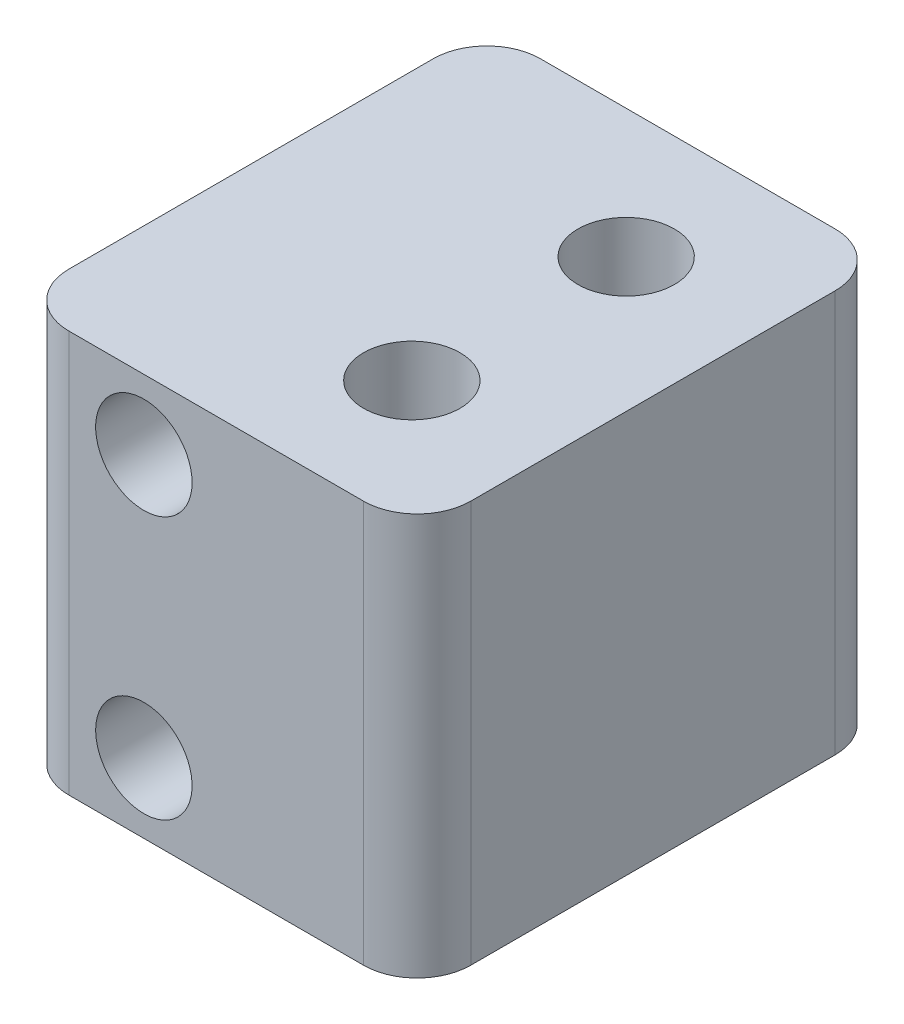
ISO-10303-21;
HEADER;
FILE_DESCRIPTION(('STEP AP214'),'2;1');
FILE_NAME('part.step','',(''),(''),'','','');
FILE_SCHEMA(('AUTOMOTIVE_DESIGN { 1 0 10303 214 1 1 1 1 }'));
ENDSEC;
DATA;
#1=APPLICATION_CONTEXT('core data for automotive mechanical design processes');
#2=APPLICATION_PROTOCOL_DEFINITION('international standard','automotive_design',2000,#1);
#3=PRODUCT_CONTEXT('',#1,'mechanical');
#4=PRODUCT('Part','Part','',(#3));
#5=PRODUCT_RELATED_PRODUCT_CATEGORY('part','',(#4));
#6=PRODUCT_DEFINITION_FORMATION('','',#4);
#7=PRODUCT_DEFINITION_CONTEXT('part definition',#1,'design');
#8=PRODUCT_DEFINITION('design','',#6,#7);
#9=PRODUCT_DEFINITION_SHAPE('','',#8);
#10=(LENGTH_UNIT() NAMED_UNIT(*) SI_UNIT(.MILLI.,.METRE.));
#11=(NAMED_UNIT(*) PLANE_ANGLE_UNIT() SI_UNIT($,.RADIAN.));
#12=(NAMED_UNIT(*) SI_UNIT($,.STERADIAN.) SOLID_ANGLE_UNIT());
#13=UNCERTAINTY_MEASURE_WITH_UNIT(LENGTH_MEASURE(1.E-05),#10,'distance_accuracy_value','');
#14=(GEOMETRIC_REPRESENTATION_CONTEXT(3) GLOBAL_UNCERTAINTY_ASSIGNED_CONTEXT((#13)) GLOBAL_UNIT_ASSIGNED_CONTEXT((#10,
#11,#12)) REPRESENTATION_CONTEXT('',''));
#15=CARTESIAN_POINT('',(0.,0.,0.));
#16=DIRECTION('',(0.,0.,1.));
#17=DIRECTION('',(1.,0.,0.));
#18=AXIS2_PLACEMENT_3D('',#15,#16,#17);
#19=CARTESIAN_POINT('',(0.,19.05,0.));
#20=DIRECTION('',(0.,1.,0.));
#21=DIRECTION('',(0.,0.,1.));
#22=AXIS2_PLACEMENT_3D('',#19,#20,#21);
#23=PLANE('',#22);
#24=CARTESIAN_POINT('',(3.175,19.05,-5.08));
#25=DIRECTION('',(0.,1.,0.));
#26=DIRECTION('',(0.,0.,1.));
#27=AXIS2_PLACEMENT_3D('',#24,#25,#26);
#28=CIRCLE('',#27,2.286);
#29=CARTESIAN_POINT('',(3.175,19.05,-7.366));
#30=VERTEX_POINT('',#29);
#31=EDGE_CURVE('E144',#30,#30,#28,.T.);
#32=ORIENTED_EDGE('',*,*,#31,.F.);
#33=EDGE_LOOP('',(#32));
#34=FACE_BOUND('',#33,.T.);
#35=DIRECTION('',(0.,0.,1.));
#36=VECTOR('',#35,1.);
#37=CARTESIAN_POINT('',(-9.525,19.05,-11.176));
#38=LINE('',#37,#36);
#39=CARTESIAN_POINT('',(-9.525,19.05,-8.636));
#40=VERTEX_POINT('',#39);
#41=CARTESIAN_POINT('',(-9.525,19.05,8.636));
#42=VERTEX_POINT('',#41);
#43=EDGE_CURVE('E191',#40,#42,#38,.T.);
#44=ORIENTED_EDGE('',*,*,#43,.T.);
#45=CARTESIAN_POINT('',(-6.985,19.05,8.636));
#46=DIRECTION('',(0.,1.,0.));
#47=DIRECTION('',(0.,0.,1.));
#48=AXIS2_PLACEMENT_3D('',#45,#46,#47);
#49=CIRCLE('',#48,2.54);
#50=CARTESIAN_POINT('',(-6.985,19.05,11.176));
#51=VERTEX_POINT('',#50);
#52=EDGE_CURVE('E52',#42,#51,#49,.T.);
#53=ORIENTED_EDGE('',*,*,#52,.T.);
#54=DIRECTION('',(1.,0.,0.));
#55=VECTOR('',#54,1.);
#56=CARTESIAN_POINT('',(-9.525,19.05,11.176));
#57=LINE('',#56,#55);
#58=CARTESIAN_POINT('',(6.985,19.05,11.176));
#59=VERTEX_POINT('',#58);
#60=EDGE_CURVE('E129',#51,#59,#57,.T.);
#61=ORIENTED_EDGE('',*,*,#60,.T.);
#62=CARTESIAN_POINT('',(6.985,19.05,8.63599999999999));
#63=DIRECTION('',(0.,1.,0.));
#64=DIRECTION('',(0.,0.,1.));
#65=AXIS2_PLACEMENT_3D('',#62,#63,#64);
#66=CIRCLE('',#65,2.54);
#67=CARTESIAN_POINT('',(9.525,19.05,8.63599999999999));
#68=VERTEX_POINT('',#67);
#69=EDGE_CURVE('E159',#59,#68,#66,.T.);
#70=ORIENTED_EDGE('',*,*,#69,.T.);
#71=DIRECTION('',(0.,0.,-1.));
#72=VECTOR('',#71,1.);
#73=CARTESIAN_POINT('',(9.525,19.05,-11.176));
#74=LINE('',#73,#72);
#75=CARTESIAN_POINT('',(9.525,19.05,-8.63599999999999));
#76=VERTEX_POINT('',#75);
#77=EDGE_CURVE('E149',#68,#76,#74,.T.);
#78=ORIENTED_EDGE('',*,*,#77,.T.);
#79=CARTESIAN_POINT('',(6.985,19.05,-8.63599999999999));
#80=DIRECTION('',(0.,1.,0.));
#81=DIRECTION('',(0.,0.,1.));
#82=AXIS2_PLACEMENT_3D('',#79,#80,#81);
#83=CIRCLE('',#82,2.54);
#84=CARTESIAN_POINT('',(6.985,19.05,-11.176));
#85=VERTEX_POINT('',#84);
#86=EDGE_CURVE('E162',#76,#85,#83,.T.);
#87=ORIENTED_EDGE('',*,*,#86,.T.);
#88=DIRECTION('',(-1.,0.,0.));
#89=VECTOR('',#88,1.);
#90=CARTESIAN_POINT('',(-9.525,19.05,-11.176));
#91=LINE('',#90,#89);
#92=CARTESIAN_POINT('',(-6.985,19.05,-11.176));
#93=VERTEX_POINT('',#92);
#94=EDGE_CURVE('E127',#85,#93,#91,.T.);
#95=ORIENTED_EDGE('',*,*,#94,.T.);
#96=CARTESIAN_POINT('',(-6.985,19.05,-8.636));
#97=DIRECTION('',(0.,1.,0.));
#98=DIRECTION('',(0.,0.,1.));
#99=AXIS2_PLACEMENT_3D('',#96,#97,#98);
#100=CIRCLE('',#99,2.54);
#101=EDGE_CURVE('E184',#93,#40,#100,.T.);
#102=ORIENTED_EDGE('',*,*,#101,.T.);
#103=EDGE_LOOP('',(#44,#53,#61,#70,#78,#87,#95,#102));
#104=FACE_BOUND('',#103,.T.);
#105=CARTESIAN_POINT('',(3.175,19.05,5.08));
#106=DIRECTION('',(0.,1.,0.));
#107=DIRECTION('',(0.,0.,-1.));
#108=AXIS2_PLACEMENT_3D('',#105,#106,#107);
#109=CIRCLE('',#108,2.286);
#110=CARTESIAN_POINT('',(3.175,19.05,2.794));
#111=VERTEX_POINT('',#110);
#112=EDGE_CURVE('E216',#111,#111,#109,.T.);
#113=ORIENTED_EDGE('',*,*,#112,.F.);
#114=EDGE_LOOP('',(#113));
#115=FACE_BOUND('',#114,.T.);
#116=ADVANCED_FACE('F43',(#34,#104,#115),#23,.T.);
#117=CARTESIAN_POINT('',(0.,0.,0.));
#118=DIRECTION('',(0.,1.,0.));
#119=DIRECTION('',(0.,0.,1.));
#120=AXIS2_PLACEMENT_3D('',#117,#118,#119);
#121=PLANE('',#120);
#122=DIRECTION('',(1.,0.,0.));
#123=VECTOR('',#122,1.);
#124=CARTESIAN_POINT('',(-9.525,0.,11.176));
#125=LINE('',#124,#123);
#126=CARTESIAN_POINT('',(-6.985,0.,11.176));
#127=VERTEX_POINT('',#126);
#128=CARTESIAN_POINT('',(6.985,0.,11.176));
#129=VERTEX_POINT('',#128);
#130=EDGE_CURVE('E142',#127,#129,#125,.T.);
#131=ORIENTED_EDGE('',*,*,#130,.F.);
#132=CARTESIAN_POINT('',(-6.985,0.,8.636));
#133=DIRECTION('',(0.,1.,0.));
#134=DIRECTION('',(0.,0.,1.));
#135=AXIS2_PLACEMENT_3D('',#132,#133,#134);
#136=CIRCLE('',#135,2.54);
#137=CARTESIAN_POINT('',(-9.525,0.,8.636));
#138=VERTEX_POINT('',#137);
#139=EDGE_CURVE('E175',#127,#138,#136,.F.);
#140=ORIENTED_EDGE('',*,*,#139,.T.);
#141=DIRECTION('',(0.,0.,1.));
#142=VECTOR('',#141,1.);
#143=CARTESIAN_POINT('',(-9.525,0.,-11.176));
#144=LINE('',#143,#142);
#145=CARTESIAN_POINT('',(-9.525,0.,-8.636));
#146=VERTEX_POINT('',#145);
#147=EDGE_CURVE('E137',#146,#138,#144,.T.);
#148=ORIENTED_EDGE('',*,*,#147,.F.);
#149=CARTESIAN_POINT('',(-6.985,0.,-8.636));
#150=DIRECTION('',(0.,1.,0.));
#151=DIRECTION('',(0.,0.,1.));
#152=AXIS2_PLACEMENT_3D('',#149,#150,#151);
#153=CIRCLE('',#152,2.54);
#154=CARTESIAN_POINT('',(-6.985,0.,-11.176));
#155=VERTEX_POINT('',#154);
#156=EDGE_CURVE('E135',#146,#155,#153,.F.);
#157=ORIENTED_EDGE('',*,*,#156,.T.);
#158=DIRECTION('',(-1.,0.,0.));
#159=VECTOR('',#158,1.);
#160=CARTESIAN_POINT('',(-9.525,0.,-11.176));
#161=LINE('',#160,#159);
#162=CARTESIAN_POINT('',(6.985,0.,-11.176));
#163=VERTEX_POINT('',#162);
#164=EDGE_CURVE('E126',#163,#155,#161,.T.);
#165=ORIENTED_EDGE('',*,*,#164,.F.);
#166=CARTESIAN_POINT('',(6.985,0.,-8.63599999999999));
#167=DIRECTION('',(0.,1.,0.));
#168=DIRECTION('',(0.,0.,1.));
#169=AXIS2_PLACEMENT_3D('',#166,#167,#168);
#170=CIRCLE('',#169,2.54);
#171=CARTESIAN_POINT('',(9.525,0.,-8.63599999999999));
#172=VERTEX_POINT('',#171);
#173=EDGE_CURVE('E111',#163,#172,#170,.F.);
#174=ORIENTED_EDGE('',*,*,#173,.T.);
#175=DIRECTION('',(0.,0.,-1.));
#176=VECTOR('',#175,1.);
#177=CARTESIAN_POINT('',(9.525,0.,-11.176));
#178=LINE('',#177,#176);
#179=CARTESIAN_POINT('',(9.525,0.,8.63599999999999));
#180=VERTEX_POINT('',#179);
#181=EDGE_CURVE('E138',#180,#172,#178,.T.);
#182=ORIENTED_EDGE('',*,*,#181,.F.);
#183=CARTESIAN_POINT('',(6.985,0.,8.63599999999999));
#184=DIRECTION('',(0.,1.,0.));
#185=DIRECTION('',(0.,0.,1.));
#186=AXIS2_PLACEMENT_3D('',#183,#184,#185);
#187=CIRCLE('',#186,2.54);
#188=EDGE_CURVE('E123',#180,#129,#187,.F.);
#189=ORIENTED_EDGE('',*,*,#188,.T.);
#190=EDGE_LOOP('',(#131,#140,#148,#157,#165,#174,#182,#189));
#191=FACE_BOUND('',#190,.T.);
#192=CARTESIAN_POINT('',(3.175,0.,-5.08));
#193=DIRECTION('',(0.,1.,0.));
#194=DIRECTION('',(0.,0.,1.));
#195=AXIS2_PLACEMENT_3D('',#192,#193,#194);
#196=CIRCLE('',#195,2.286);
#197=CARTESIAN_POINT('',(3.175,0.,-7.366));
#198=VERTEX_POINT('',#197);
#199=EDGE_CURVE('E212',#198,#198,#196,.T.);
#200=ORIENTED_EDGE('',*,*,#199,.T.);
#201=EDGE_LOOP('',(#200));
#202=FACE_BOUND('',#201,.T.);
#203=CARTESIAN_POINT('',(3.175,0.,5.08));
#204=DIRECTION('',(0.,1.,0.));
#205=DIRECTION('',(0.,0.,-1.));
#206=AXIS2_PLACEMENT_3D('',#203,#204,#205);
#207=CIRCLE('',#206,2.286);
#208=CARTESIAN_POINT('',(3.175,0.,2.794));
#209=VERTEX_POINT('',#208);
#210=EDGE_CURVE('E220',#209,#209,#207,.T.);
#211=ORIENTED_EDGE('',*,*,#210,.T.);
#212=EDGE_LOOP('',(#211));
#213=FACE_BOUND('',#212,.T.);
#214=ADVANCED_FACE('F132',(#191,#202,#213),#121,.F.);
#215=CARTESIAN_POINT('',(9.525,19.05,-11.176));
#216=DIRECTION('',(-1.,0.,0.));
#217=DIRECTION('',(0.,0.,1.));
#218=AXIS2_PLACEMENT_3D('',#215,#216,#217);
#219=PLANE('',#218);
#220=ORIENTED_EDGE('',*,*,#181,.T.);
#221=DIRECTION('',(0.,-1.,0.));
#222=VECTOR('',#221,1.);
#223=CARTESIAN_POINT('',(9.525,19.05,-8.63599999999999));
#224=LINE('',#223,#222);
#225=EDGE_CURVE('E116',#172,#76,#224,.F.);
#226=ORIENTED_EDGE('',*,*,#225,.T.);
#227=ORIENTED_EDGE('',*,*,#77,.F.);
#228=DIRECTION('',(0.,-1.,0.));
#229=VECTOR('',#228,1.);
#230=CARTESIAN_POINT('',(9.525,19.05,8.63599999999999));
#231=LINE('',#230,#229);
#232=EDGE_CURVE('E122',#68,#180,#231,.T.);
#233=ORIENTED_EDGE('',*,*,#232,.T.);
#234=EDGE_LOOP('',(#220,#226,#227,#233));
#235=FACE_BOUND('',#234,.T.);
#236=ADVANCED_FACE('F273',(#235),#219,.F.);
#237=CARTESIAN_POINT('',(-9.525,19.05,-11.176));
#238=DIRECTION('',(0.,0.,1.));
#239=DIRECTION('',(1.,0.,0.));
#240=AXIS2_PLACEMENT_3D('',#237,#238,#239);
#241=PLANE('',#240);
#242=CARTESIAN_POINT('',(-3.42899999999999,15.748,-11.176));
#243=DIRECTION('',(0.,0.,1.));
#244=DIRECTION('',(1.,0.,0.));
#245=AXIS2_PLACEMENT_3D('',#242,#243,#244);
#246=CIRCLE('',#245,2.286);
#247=CARTESIAN_POINT('',(-1.14299999999999,15.748,-11.176));
#248=VERTEX_POINT('',#247);
#249=EDGE_CURVE('E224',#248,#248,#246,.T.);
#250=ORIENTED_EDGE('',*,*,#249,.T.);
#251=EDGE_LOOP('',(#250));
#252=FACE_BOUND('',#251,.T.);
#253=CARTESIAN_POINT('',(-3.42899999999999,3.302,-11.176));
#254=DIRECTION('',(0.,0.,1.));
#255=DIRECTION('',(-1.,0.,0.));
#256=AXIS2_PLACEMENT_3D('',#253,#254,#255);
#257=CIRCLE('',#256,2.286);
#258=CARTESIAN_POINT('',(-5.71499999999999,3.302,-11.176));
#259=VERTEX_POINT('',#258);
#260=EDGE_CURVE('E228',#259,#259,#257,.T.);
#261=ORIENTED_EDGE('',*,*,#260,.T.);
#262=EDGE_LOOP('',(#261));
#263=FACE_BOUND('',#262,.T.);
#264=ORIENTED_EDGE('',*,*,#164,.T.);
#265=DIRECTION('',(0.,-1.,0.));
#266=VECTOR('',#265,1.);
#267=CARTESIAN_POINT('',(-6.985,19.05,-11.176));
#268=LINE('',#267,#266);
#269=EDGE_CURVE('E11',#155,#93,#268,.F.);
#270=ORIENTED_EDGE('',*,*,#269,.T.);
#271=ORIENTED_EDGE('',*,*,#94,.F.);
#272=DIRECTION('',(0.,-1.,0.));
#273=VECTOR('',#272,1.);
#274=CARTESIAN_POINT('',(6.985,19.05,-11.176));
#275=LINE('',#274,#273);
#276=EDGE_CURVE('E115',#85,#163,#275,.T.);
#277=ORIENTED_EDGE('',*,*,#276,.T.);
#278=EDGE_LOOP('',(#264,#270,#271,#277));
#279=FACE_BOUND('',#278,.T.);
#280=ADVANCED_FACE('F125',(#252,#263,#279),#241,.F.);
#281=CARTESIAN_POINT('',(-9.525,19.05,-11.176));
#282=DIRECTION('',(1.,0.,0.));
#283=DIRECTION('',(0.,0.,-1.));
#284=AXIS2_PLACEMENT_3D('',#281,#282,#283);
#285=PLANE('',#284);
#286=ORIENTED_EDGE('',*,*,#147,.T.);
#287=DIRECTION('',(0.,-1.,0.));
#288=VECTOR('',#287,1.);
#289=CARTESIAN_POINT('',(-9.525,19.05,8.636));
#290=LINE('',#289,#288);
#291=EDGE_CURVE('E65',#138,#42,#290,.F.);
#292=ORIENTED_EDGE('',*,*,#291,.T.);
#293=ORIENTED_EDGE('',*,*,#43,.F.);
#294=DIRECTION('',(0.,-1.,0.));
#295=VECTOR('',#294,1.);
#296=CARTESIAN_POINT('',(-9.525,19.05,-8.636));
#297=LINE('',#296,#295);
#298=EDGE_CURVE('E178',#40,#146,#297,.T.);
#299=ORIENTED_EDGE('',*,*,#298,.T.);
#300=EDGE_LOOP('',(#286,#292,#293,#299));
#301=FACE_BOUND('',#300,.T.);
#302=ADVANCED_FACE('F200',(#301),#285,.F.);
#303=CARTESIAN_POINT('',(-9.525,19.05,11.176));
#304=DIRECTION('',(0.,0.,-1.));
#305=DIRECTION('',(-1.,0.,0.));
#306=AXIS2_PLACEMENT_3D('',#303,#304,#305);
#307=PLANE('',#306);
#308=CARTESIAN_POINT('',(-3.42899999999999,15.748,11.176));
#309=DIRECTION('',(0.,0.,1.));
#310=DIRECTION('',(1.,0.,0.));
#311=AXIS2_PLACEMENT_3D('',#308,#309,#310);
#312=CIRCLE('',#311,2.286);
#313=CARTESIAN_POINT('',(-1.14299999999999,15.748,11.176));
#314=VERTEX_POINT('',#313);
#315=EDGE_CURVE('E236',#314,#314,#312,.T.);
#316=ORIENTED_EDGE('',*,*,#315,.F.);
#317=EDGE_LOOP('',(#316));
#318=FACE_BOUND('',#317,.T.);
#319=CARTESIAN_POINT('',(-3.42899999999999,3.302,11.176));
#320=DIRECTION('',(0.,0.,1.));
#321=DIRECTION('',(-1.,0.,0.));
#322=AXIS2_PLACEMENT_3D('',#319,#320,#321);
#323=CIRCLE('',#322,2.286);
#324=CARTESIAN_POINT('',(-5.71499999999999,3.302,11.176));
#325=VERTEX_POINT('',#324);
#326=EDGE_CURVE('E232',#325,#325,#323,.T.);
#327=ORIENTED_EDGE('',*,*,#326,.F.);
#328=EDGE_LOOP('',(#327));
#329=FACE_BOUND('',#328,.T.);
#330=ORIENTED_EDGE('',*,*,#60,.F.);
#331=DIRECTION('',(0.,-1.,0.));
#332=VECTOR('',#331,1.);
#333=CARTESIAN_POINT('',(-6.985,19.05,11.176));
#334=LINE('',#333,#332);
#335=EDGE_CURVE('E169',#51,#127,#334,.T.);
#336=ORIENTED_EDGE('',*,*,#335,.T.);
#337=ORIENTED_EDGE('',*,*,#130,.T.);
#338=DIRECTION('',(0.,-1.,0.));
#339=VECTOR('',#338,1.);
#340=CARTESIAN_POINT('',(6.98500000000001,19.05,11.176));
#341=LINE('',#340,#339);
#342=EDGE_CURVE('E165',#129,#59,#341,.F.);
#343=ORIENTED_EDGE('',*,*,#342,.T.);
#344=EDGE_LOOP('',(#330,#336,#337,#343));
#345=FACE_BOUND('',#344,.T.);
#346=ADVANCED_FACE('F195',(#318,#329,#345),#307,.F.);
#347=CARTESIAN_POINT('',(3.175,19.05,-5.08));
#348=DIRECTION('',(0.,-1.,0.));
#349=DIRECTION('',(0.,0.,-1.));
#350=AXIS2_PLACEMENT_3D('',#347,#348,#349);
#351=CYLINDRICAL_SURFACE('',#350,2.286);
#352=CARTESIAN_POINT('',(3.175,19.05,-7.366));
#353=CARTESIAN_POINT('',(3.175,18.8515625,-7.366));
#354=CARTESIAN_POINT('',(3.175,18.653125,-7.366));
#355=CARTESIAN_POINT('',(3.175,18.25625,-7.366));
#356=CARTESIAN_POINT('',(3.175,18.0578125,-7.366));
#357=CARTESIAN_POINT('',(3.175,17.6609375,-7.366));
#358=CARTESIAN_POINT('',(3.175,17.4625,-7.366));
#359=CARTESIAN_POINT('',(3.175,17.065625,-7.366));
#360=CARTESIAN_POINT('',(3.175,16.8671875,-7.366));
#361=CARTESIAN_POINT('',(3.175,16.4703125,-7.366));
#362=CARTESIAN_POINT('',(3.175,16.271875,-7.366));
#363=CARTESIAN_POINT('',(3.175,15.875,-7.366));
#364=CARTESIAN_POINT('',(3.175,15.6765625,-7.366));
#365=CARTESIAN_POINT('',(3.175,15.2796875,-7.366));
#366=CARTESIAN_POINT('',(3.175,15.08125,-7.366));
#367=CARTESIAN_POINT('',(3.175,14.684375,-7.366));
#368=CARTESIAN_POINT('',(3.175,14.4859375,-7.366));
#369=CARTESIAN_POINT('',(3.175,14.0890625,-7.366));
#370=CARTESIAN_POINT('',(3.175,13.890625,-7.366));
#371=CARTESIAN_POINT('',(3.175,13.49375,-7.366));
#372=CARTESIAN_POINT('',(3.175,13.2953125,-7.366));
#373=CARTESIAN_POINT('',(3.175,12.8984375,-7.366));
#374=CARTESIAN_POINT('',(3.175,12.7,-7.366));
#375=CARTESIAN_POINT('',(3.175,12.303125,-7.366));
#376=CARTESIAN_POINT('',(3.175,12.1046875,-7.366));
#377=CARTESIAN_POINT('',(3.175,11.7078125,-7.366));
#378=CARTESIAN_POINT('',(3.175,11.509375,-7.366));
#379=CARTESIAN_POINT('',(3.175,11.1125,-7.366));
#380=CARTESIAN_POINT('',(3.175,10.9140625,-7.366));
#381=CARTESIAN_POINT('',(3.175,10.5171875,-7.366));
#382=CARTESIAN_POINT('',(3.175,10.31875,-7.366));
#383=CARTESIAN_POINT('',(3.175,9.921875,-7.366));
#384=CARTESIAN_POINT('',(3.175,9.7234375,-7.366));
#385=CARTESIAN_POINT('',(3.175,9.3265625,-7.366));
#386=CARTESIAN_POINT('',(3.175,9.128125,-7.366));
#387=CARTESIAN_POINT('',(3.175,8.73125,-7.366));
#388=CARTESIAN_POINT('',(3.175,8.5328125,-7.366));
#389=CARTESIAN_POINT('',(3.175,8.1359375,-7.366));
#390=CARTESIAN_POINT('',(3.175,7.9375,-7.366));
#391=CARTESIAN_POINT('',(3.175,7.540625,-7.366));
#392=CARTESIAN_POINT('',(3.175,7.3421875,-7.366));
#393=CARTESIAN_POINT('',(3.175,6.9453125,-7.366));
#394=CARTESIAN_POINT('',(3.175,6.746875,-7.366));
#395=CARTESIAN_POINT('',(3.175,6.35,-7.366));
#396=CARTESIAN_POINT('',(3.175,6.1515625,-7.366));
#397=CARTESIAN_POINT('',(3.175,5.7546875,-7.366));
#398=CARTESIAN_POINT('',(3.175,5.55625,-7.366));
#399=CARTESIAN_POINT('',(3.175,5.159375,-7.366));
#400=CARTESIAN_POINT('',(3.175,4.9609375,-7.366));
#401=CARTESIAN_POINT('',(3.175,4.5640625,-7.366));
#402=CARTESIAN_POINT('',(3.175,4.365625,-7.366));
#403=CARTESIAN_POINT('',(3.175,3.96875,-7.366));
#404=CARTESIAN_POINT('',(3.175,3.7703125,-7.366));
#405=CARTESIAN_POINT('',(3.175,3.3734375,-7.366));
#406=CARTESIAN_POINT('',(3.175,3.175,-7.366));
#407=CARTESIAN_POINT('',(3.175,2.778125,-7.366));
#408=CARTESIAN_POINT('',(3.175,2.5796875,-7.366));
#409=CARTESIAN_POINT('',(3.175,2.1828125,-7.366));
#410=CARTESIAN_POINT('',(3.175,1.984375,-7.366));
#411=CARTESIAN_POINT('',(3.175,1.5875,-7.366));
#412=CARTESIAN_POINT('',(3.175,1.3890625,-7.366));
#413=CARTESIAN_POINT('',(3.175,0.992187500000001,-7.366));
#414=CARTESIAN_POINT('',(3.175,0.793750000000001,-7.366));
#415=CARTESIAN_POINT('',(3.175,0.396875,-7.366));
#416=CARTESIAN_POINT('',(3.175,0.1984375,-7.366));
#417=CARTESIAN_POINT('',(3.175,0.,-7.366));
#418=B_SPLINE_CURVE_WITH_KNOTS('',3,(#352,#353,#354,#355,#356,#357,#358,#359,#360,#361,#362,
#363,#364,#365,#366,#367,#368,#369,#370,#371,#372,#373,#374,#375,#376,#377,#378,#379,#380,#381,
#382,#383,#384,#385,#386,#387,#388,#389,#390,#391,#392,#393,#394,#395,#396,#397,#398,#399,#400,
#401,#402,#403,#404,#405,#406,#407,#408,#409,#410,#411,#412,#413,#414,#415,#416,#417),
.UNSPECIFIED.,.F.,.F.,(4,2,2,2,2,2,2,2,2,2,2,2,2,2,2,2,2,2,2,2,2,2,2,2,2,2,2,2,2,2,2,2,4),(0.,
0.5953125,1.190625,1.7859375,2.38125,2.9765625,3.571875,4.1671875,4.7625,5.3578125,5.953125,
6.5484375,7.14375,7.7390625,8.334375,8.9296875,9.525,10.1203125,10.715625,11.3109375,11.90625,
12.5015625,13.096875,13.6921875,14.2875,14.8828125,15.478125,16.0734375,16.66875,17.2640625,
17.859375,18.4546875,19.05),.UNSPECIFIED.);
#419=EDGE_CURVE('BSEAM255',#30,#198,#418,.T.);
#420=ORIENTED_EDGE('',*,*,#31,.T.);
#421=ORIENTED_EDGE('',*,*,#199,.F.);
#422=ORIENTED_EDGE('',*,*,#419,.T.);
#423=ORIENTED_EDGE('',*,*,#419,.F.);
#424=EDGE_LOOP('',(#420,#422,#421,#423));
#425=FACE_BOUND('',#424,.T.);
#426=ADVANCED_FACE('F255',(#425),#351,.F.);
#427=CARTESIAN_POINT('',(3.175,19.05,5.08));
#428=DIRECTION('',(0.,-1.,0.));
#429=DIRECTION('',(0.,0.,-1.));
#430=AXIS2_PLACEMENT_3D('',#427,#428,#429);
#431=CYLINDRICAL_SURFACE('',#430,2.286);
#432=CARTESIAN_POINT('',(3.175,19.05,2.794));
#433=CARTESIAN_POINT('',(3.175,18.8515625,2.794));
#434=CARTESIAN_POINT('',(3.175,18.653125,2.794));
#435=CARTESIAN_POINT('',(3.175,18.25625,2.794));
#436=CARTESIAN_POINT('',(3.175,18.0578125,2.794));
#437=CARTESIAN_POINT('',(3.175,17.6609375,2.794));
#438=CARTESIAN_POINT('',(3.175,17.4625,2.794));
#439=CARTESIAN_POINT('',(3.175,17.065625,2.794));
#440=CARTESIAN_POINT('',(3.175,16.8671875,2.794));
#441=CARTESIAN_POINT('',(3.175,16.4703125,2.794));
#442=CARTESIAN_POINT('',(3.175,16.271875,2.794));
#443=CARTESIAN_POINT('',(3.175,15.875,2.794));
#444=CARTESIAN_POINT('',(3.175,15.6765625,2.794));
#445=CARTESIAN_POINT('',(3.175,15.2796875,2.794));
#446=CARTESIAN_POINT('',(3.175,15.08125,2.794));
#447=CARTESIAN_POINT('',(3.175,14.684375,2.794));
#448=CARTESIAN_POINT('',(3.175,14.4859375,2.794));
#449=CARTESIAN_POINT('',(3.175,14.0890625,2.794));
#450=CARTESIAN_POINT('',(3.175,13.890625,2.794));
#451=CARTESIAN_POINT('',(3.175,13.49375,2.794));
#452=CARTESIAN_POINT('',(3.175,13.2953125,2.794));
#453=CARTESIAN_POINT('',(3.175,12.8984375,2.794));
#454=CARTESIAN_POINT('',(3.175,12.7,2.794));
#455=CARTESIAN_POINT('',(3.175,12.303125,2.794));
#456=CARTESIAN_POINT('',(3.175,12.1046875,2.794));
#457=CARTESIAN_POINT('',(3.175,11.7078125,2.794));
#458=CARTESIAN_POINT('',(3.175,11.509375,2.794));
#459=CARTESIAN_POINT('',(3.175,11.1125,2.794));
#460=CARTESIAN_POINT('',(3.175,10.9140625,2.794));
#461=CARTESIAN_POINT('',(3.175,10.5171875,2.794));
#462=CARTESIAN_POINT('',(3.175,10.31875,2.794));
#463=CARTESIAN_POINT('',(3.175,9.921875,2.794));
#464=CARTESIAN_POINT('',(3.175,9.7234375,2.794));
#465=CARTESIAN_POINT('',(3.175,9.3265625,2.794));
#466=CARTESIAN_POINT('',(3.175,9.128125,2.794));
#467=CARTESIAN_POINT('',(3.175,8.73125,2.794));
#468=CARTESIAN_POINT('',(3.175,8.5328125,2.794));
#469=CARTESIAN_POINT('',(3.175,8.1359375,2.794));
#470=CARTESIAN_POINT('',(3.175,7.9375,2.794));
#471=CARTESIAN_POINT('',(3.175,7.540625,2.794));
#472=CARTESIAN_POINT('',(3.175,7.3421875,2.794));
#473=CARTESIAN_POINT('',(3.175,6.9453125,2.794));
#474=CARTESIAN_POINT('',(3.175,6.746875,2.794));
#475=CARTESIAN_POINT('',(3.175,6.35,2.794));
#476=CARTESIAN_POINT('',(3.175,6.1515625,2.794));
#477=CARTESIAN_POINT('',(3.175,5.7546875,2.794));
#478=CARTESIAN_POINT('',(3.175,5.55625,2.794));
#479=CARTESIAN_POINT('',(3.175,5.159375,2.794));
#480=CARTESIAN_POINT('',(3.175,4.9609375,2.794));
#481=CARTESIAN_POINT('',(3.175,4.5640625,2.794));
#482=CARTESIAN_POINT('',(3.175,4.365625,2.794));
#483=CARTESIAN_POINT('',(3.175,3.96875,2.794));
#484=CARTESIAN_POINT('',(3.175,3.7703125,2.794));
#485=CARTESIAN_POINT('',(3.175,3.3734375,2.794));
#486=CARTESIAN_POINT('',(3.175,3.175,2.794));
#487=CARTESIAN_POINT('',(3.175,2.778125,2.794));
#488=CARTESIAN_POINT('',(3.175,2.5796875,2.794));
#489=CARTESIAN_POINT('',(3.175,2.1828125,2.794));
#490=CARTESIAN_POINT('',(3.175,1.984375,2.794));
#491=CARTESIAN_POINT('',(3.175,1.5875,2.794));
#492=CARTESIAN_POINT('',(3.175,1.3890625,2.794));
#493=CARTESIAN_POINT('',(3.175,0.992187500000001,2.794));
#494=CARTESIAN_POINT('',(3.175,0.793750000000001,2.794));
#495=CARTESIAN_POINT('',(3.175,0.396875,2.794));
#496=CARTESIAN_POINT('',(3.175,0.1984375,2.794));
#497=CARTESIAN_POINT('',(3.175,0.,2.794));
#498=B_SPLINE_CURVE_WITH_KNOTS('',3,(#432,#433,#434,#435,#436,#437,#438,#439,#440,#441,#442,
#443,#444,#445,#446,#447,#448,#449,#450,#451,#452,#453,#454,#455,#456,#457,#458,#459,#460,#461,
#462,#463,#464,#465,#466,#467,#468,#469,#470,#471,#472,#473,#474,#475,#476,#477,#478,#479,#480,
#481,#482,#483,#484,#485,#486,#487,#488,#489,#490,#491,#492,#493,#494,#495,#496,#497),
.UNSPECIFIED.,.F.,.F.,(4,2,2,2,2,2,2,2,2,2,2,2,2,2,2,2,2,2,2,2,2,2,2,2,2,2,2,2,2,2,2,2,4),(0.,
0.5953125,1.190625,1.7859375,2.38125,2.9765625,3.571875,4.1671875,4.7625,5.3578125,5.953125,
6.5484375,7.14375,7.7390625,8.334375,8.9296875,9.525,10.1203125,10.715625,11.3109375,11.90625,
12.5015625,13.096875,13.6921875,14.2875,14.8828125,15.478125,16.0734375,16.66875,17.2640625,
17.859375,18.4546875,19.05),.UNSPECIFIED.);
#499=EDGE_CURVE('BSEAM288',#111,#209,#498,.T.);
#500=ORIENTED_EDGE('',*,*,#112,.T.);
#501=ORIENTED_EDGE('',*,*,#210,.F.);
#502=ORIENTED_EDGE('',*,*,#499,.T.);
#503=ORIENTED_EDGE('',*,*,#499,.F.);
#504=EDGE_LOOP('',(#500,#502,#501,#503));
#505=FACE_BOUND('',#504,.T.);
#506=ADVANCED_FACE('F288',(#505),#431,.F.);
#507=CARTESIAN_POINT('',(6.985,19.05,-8.63599999999999));
#508=DIRECTION('',(0.,-1.,0.));
#509=DIRECTION('',(0.,0.,-1.));
#510=AXIS2_PLACEMENT_3D('',#507,#508,#509);
#511=CYLINDRICAL_SURFACE('',#510,2.54);
#512=ORIENTED_EDGE('',*,*,#86,.F.);
#513=ORIENTED_EDGE('',*,*,#225,.F.);
#514=ORIENTED_EDGE('',*,*,#173,.F.);
#515=ORIENTED_EDGE('',*,*,#276,.F.);
#516=EDGE_LOOP('',(#512,#513,#514,#515));
#517=FACE_BOUND('',#516,.T.);
#518=ADVANCED_FACE('F114',(#517),#511,.T.);
#519=CARTESIAN_POINT('',(6.985,19.05,8.63599999999999));
#520=DIRECTION('',(0.,-1.,0.));
#521=DIRECTION('',(0.,0.,-1.));
#522=AXIS2_PLACEMENT_3D('',#519,#520,#521);
#523=CYLINDRICAL_SURFACE('',#522,2.54);
#524=ORIENTED_EDGE('',*,*,#69,.F.);
#525=ORIENTED_EDGE('',*,*,#342,.F.);
#526=ORIENTED_EDGE('',*,*,#188,.F.);
#527=ORIENTED_EDGE('',*,*,#232,.F.);
#528=EDGE_LOOP('',(#524,#525,#526,#527));
#529=FACE_BOUND('',#528,.T.);
#530=ADVANCED_FACE('F287',(#529),#523,.T.);
#531=CARTESIAN_POINT('',(-6.985,19.05,8.636));
#532=DIRECTION('',(0.,-1.,0.));
#533=DIRECTION('',(0.,0.,-1.));
#534=AXIS2_PLACEMENT_3D('',#531,#532,#533);
#535=CYLINDRICAL_SURFACE('',#534,2.54);
#536=ORIENTED_EDGE('',*,*,#52,.F.);
#537=ORIENTED_EDGE('',*,*,#291,.F.);
#538=ORIENTED_EDGE('',*,*,#139,.F.);
#539=ORIENTED_EDGE('',*,*,#335,.F.);
#540=EDGE_LOOP('',(#536,#537,#538,#539));
#541=FACE_BOUND('',#540,.T.);
#542=ADVANCED_FACE('F199',(#541),#535,.T.);
#543=CARTESIAN_POINT('',(-6.985,19.05,-8.636));
#544=DIRECTION('',(0.,-1.,0.));
#545=DIRECTION('',(0.,0.,-1.));
#546=AXIS2_PLACEMENT_3D('',#543,#544,#545);
#547=CYLINDRICAL_SURFACE('',#546,2.54);
#548=ORIENTED_EDGE('',*,*,#101,.F.);
#549=ORIENTED_EDGE('',*,*,#269,.F.);
#550=ORIENTED_EDGE('',*,*,#156,.F.);
#551=ORIENTED_EDGE('',*,*,#298,.F.);
#552=EDGE_LOOP('',(#548,#549,#550,#551));
#553=FACE_BOUND('',#552,.T.);
#554=ADVANCED_FACE('F45',(#553),#547,.T.);
#555=CARTESIAN_POINT('',(-3.42899999999999,3.302,-11.176));
#556=DIRECTION('',(0.,0.,1.));
#557=DIRECTION('',(1.,0.,0.));
#558=AXIS2_PLACEMENT_3D('',#555,#556,#557);
#559=CYLINDRICAL_SURFACE('',#558,2.286);
#560=ORIENTED_EDGE('',*,*,#260,.F.);
#561=EDGE_LOOP('',(#560));
#562=FACE_BOUND('',#561,.T.);
#563=ORIENTED_EDGE('',*,*,#326,.T.);
#564=EDGE_LOOP('',(#563));
#565=FACE_BOUND('',#564,.T.);
#566=ADVANCED_FACE('F249',(#562,#565),#559,.F.);
#567=CARTESIAN_POINT('',(-3.42899999999999,15.748,-11.176));
#568=DIRECTION('',(0.,0.,1.));
#569=DIRECTION('',(1.,0.,0.));
#570=AXIS2_PLACEMENT_3D('',#567,#568,#569);
#571=CYLINDRICAL_SURFACE('',#570,2.286);
#572=ORIENTED_EDGE('',*,*,#249,.F.);
#573=EDGE_LOOP('',(#572));
#574=FACE_BOUND('',#573,.T.);
#575=ORIENTED_EDGE('',*,*,#315,.T.);
#576=EDGE_LOOP('',(#575));
#577=FACE_BOUND('',#576,.T.);
#578=ADVANCED_FACE('F246',(#574,#577),#571,.F.);
#579=CLOSED_SHELL('',(#116,#214,#236,#280,#302,#346,#426,#506,#518,#530,#542,#554,#566,#578));
#580=MANIFOLD_SOLID_BREP('B2',#579);
#581=ADVANCED_BREP_SHAPE_REPRESENTATION('',(#18,#580),#14);
#582=SHAPE_DEFINITION_REPRESENTATION(#9,#581);
ENDSEC;
END-ISO-10303-21;
